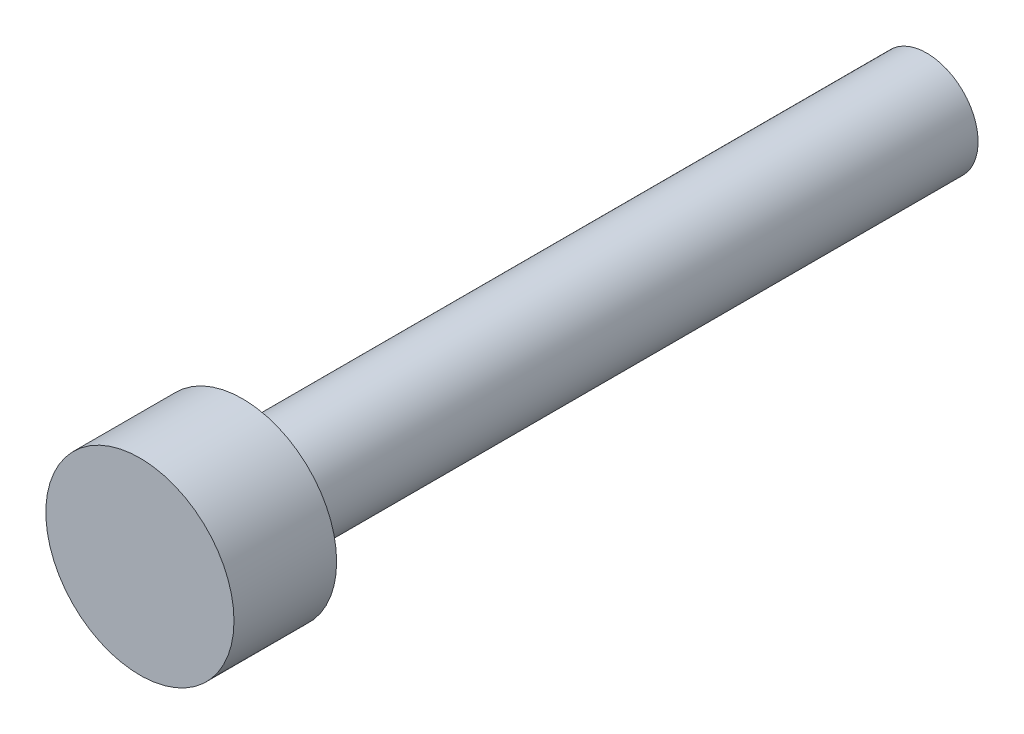
ISO-10303-21;
HEADER;
FILE_DESCRIPTION(('STEP AP214'),'2;1');
FILE_NAME('part.step','',(''),(''),'','','');
FILE_SCHEMA(('AUTOMOTIVE_DESIGN { 1 0 10303 214 1 1 1 1 }'));
ENDSEC;
DATA;
#1=APPLICATION_CONTEXT('core data for automotive mechanical design processes');
#2=APPLICATION_PROTOCOL_DEFINITION('international standard','automotive_design',2000,#1);
#3=PRODUCT_CONTEXT('',#1,'mechanical');
#4=PRODUCT('Part','Part','',(#3));
#5=PRODUCT_RELATED_PRODUCT_CATEGORY('part','',(#4));
#6=PRODUCT_DEFINITION_FORMATION('','',#4);
#7=PRODUCT_DEFINITION_CONTEXT('part definition',#1,'design');
#8=PRODUCT_DEFINITION('design','',#6,#7);
#9=PRODUCT_DEFINITION_SHAPE('','',#8);
#10=(LENGTH_UNIT() NAMED_UNIT(*) SI_UNIT(.MILLI.,.METRE.));
#11=(NAMED_UNIT(*) PLANE_ANGLE_UNIT() SI_UNIT($,.RADIAN.));
#12=(NAMED_UNIT(*) SI_UNIT($,.STERADIAN.) SOLID_ANGLE_UNIT());
#13=UNCERTAINTY_MEASURE_WITH_UNIT(LENGTH_MEASURE(1.E-05),#10,'distance_accuracy_value','');
#14=(GEOMETRIC_REPRESENTATION_CONTEXT(3) GLOBAL_UNCERTAINTY_ASSIGNED_CONTEXT((#13)) GLOBAL_UNIT_ASSIGNED_CONTEXT((#10,
#11,#12)) REPRESENTATION_CONTEXT('',''));
#15=CARTESIAN_POINT('',(0.,0.,0.));
#16=DIRECTION('',(0.,0.,1.));
#17=DIRECTION('',(1.,0.,0.));
#18=AXIS2_PLACEMENT_3D('',#15,#16,#17);
#19=CARTESIAN_POINT('',(0.,0.,3.));
#20=DIRECTION('',(0.,0.,-1.));
#21=DIRECTION('',(-1.,0.,0.));
#22=AXIS2_PLACEMENT_3D('',#19,#20,#21);
#23=CYLINDRICAL_SURFACE('',#22,2.75);
#24=CARTESIAN_POINT('',(0.,0.,3.));
#25=DIRECTION('',(0.,0.,1.));
#26=DIRECTION('',(1.,0.,0.));
#27=AXIS2_PLACEMENT_3D('',#24,#25,#26);
#28=CIRCLE('',#27,2.75);
#29=CARTESIAN_POINT('',(2.75,0.,3.));
#30=VERTEX_POINT('',#29);
#31=EDGE_CURVE('E44',#30,#30,#28,.T.);
#32=ORIENTED_EDGE('',*,*,#31,.F.);
#33=EDGE_LOOP('',(#32));
#34=FACE_BOUND('',#33,.T.);
#35=CARTESIAN_POINT('',(0.,0.,0.));
#36=DIRECTION('',(0.,0.,1.));
#37=DIRECTION('',(1.,0.,0.));
#38=AXIS2_PLACEMENT_3D('',#35,#36,#37);
#39=CIRCLE('',#38,2.75);
#40=CARTESIAN_POINT('',(2.75,0.,0.));
#41=VERTEX_POINT('',#40);
#42=EDGE_CURVE('E40',#41,#41,#39,.T.);
#43=ORIENTED_EDGE('',*,*,#42,.T.);
#44=EDGE_LOOP('',(#43));
#45=FACE_BOUND('',#44,.T.);
#46=ADVANCED_FACE('F37',(#34,#45),#23,.T.);
#47=CARTESIAN_POINT('',(0.,0.,3.));
#48=DIRECTION('',(0.,0.,1.));
#49=DIRECTION('',(1.,0.,0.));
#50=AXIS2_PLACEMENT_3D('',#47,#48,#49);
#51=PLANE('',#50);
#52=ORIENTED_EDGE('',*,*,#31,.T.);
#53=EDGE_LOOP('',(#52));
#54=FACE_BOUND('',#53,.T.);
#55=ADVANCED_FACE('F61',(#54),#51,.T.);
#56=CARTESIAN_POINT('',(0.,0.,0.));
#57=DIRECTION('',(0.,0.,1.));
#58=DIRECTION('',(1.,0.,0.));
#59=AXIS2_PLACEMENT_3D('',#56,#57,#58);
#60=PLANE('',#59);
#61=CARTESIAN_POINT('',(0.,0.,0.));
#62=DIRECTION('',(0.,0.,-1.));
#63=DIRECTION('',(-1.,0.,0.));
#64=AXIS2_PLACEMENT_3D('',#61,#62,#63);
#65=CIRCLE('',#64,1.5);
#66=CARTESIAN_POINT('',(-1.5,0.,0.));
#67=VERTEX_POINT('',#66);
#68=EDGE_CURVE('E10',#67,#67,#65,.T.);
#69=ORIENTED_EDGE('',*,*,#68,.F.);
#70=EDGE_LOOP('',(#69));
#71=FACE_BOUND('',#70,.T.);
#72=ORIENTED_EDGE('',*,*,#42,.F.);
#73=EDGE_LOOP('',(#72));
#74=FACE_BOUND('',#73,.T.);
#75=ADVANCED_FACE('F58',(#71,#74),#60,.F.);
#76=CARTESIAN_POINT('',(0.,0.,-20.));
#77=DIRECTION('',(0.,0.,1.));
#78=DIRECTION('',(1.,0.,0.));
#79=AXIS2_PLACEMENT_3D('',#76,#77,#78);
#80=CYLINDRICAL_SURFACE('',#79,1.5);
#81=CARTESIAN_POINT('',(0.,0.,-20.));
#82=DIRECTION('',(0.,0.,-1.));
#83=DIRECTION('',(-1.,0.,0.));
#84=AXIS2_PLACEMENT_3D('',#81,#82,#83);
#85=CIRCLE('',#84,1.5);
#86=CARTESIAN_POINT('',(-1.5,0.,-20.));
#87=VERTEX_POINT('',#86);
#88=EDGE_CURVE('E50',#87,#87,#85,.T.);
#89=ORIENTED_EDGE('',*,*,#88,.F.);
#90=EDGE_LOOP('',(#89));
#91=FACE_BOUND('',#90,.T.);
#92=ORIENTED_EDGE('',*,*,#68,.T.);
#93=EDGE_LOOP('',(#92));
#94=FACE_BOUND('',#93,.T.);
#95=ADVANCED_FACE('F60',(#91,#94),#80,.T.);
#96=CARTESIAN_POINT('',(0.,0.,-20.));
#97=DIRECTION('',(0.,0.,-1.));
#98=DIRECTION('',(-1.,0.,0.));
#99=AXIS2_PLACEMENT_3D('',#96,#97,#98);
#100=PLANE('',#99);
#101=ORIENTED_EDGE('',*,*,#88,.T.);
#102=EDGE_LOOP('',(#101));
#103=FACE_BOUND('',#102,.T.);
#104=ADVANCED_FACE('F67',(#103),#100,.T.);
#105=CLOSED_SHELL('',(#46,#55,#75,#95,#104));
#106=MANIFOLD_SOLID_BREP('B2',#105);
#107=ADVANCED_BREP_SHAPE_REPRESENTATION('',(#18,#106),#14);
#108=SHAPE_DEFINITION_REPRESENTATION(#9,#107);
ENDSEC;
END-ISO-10303-21;
